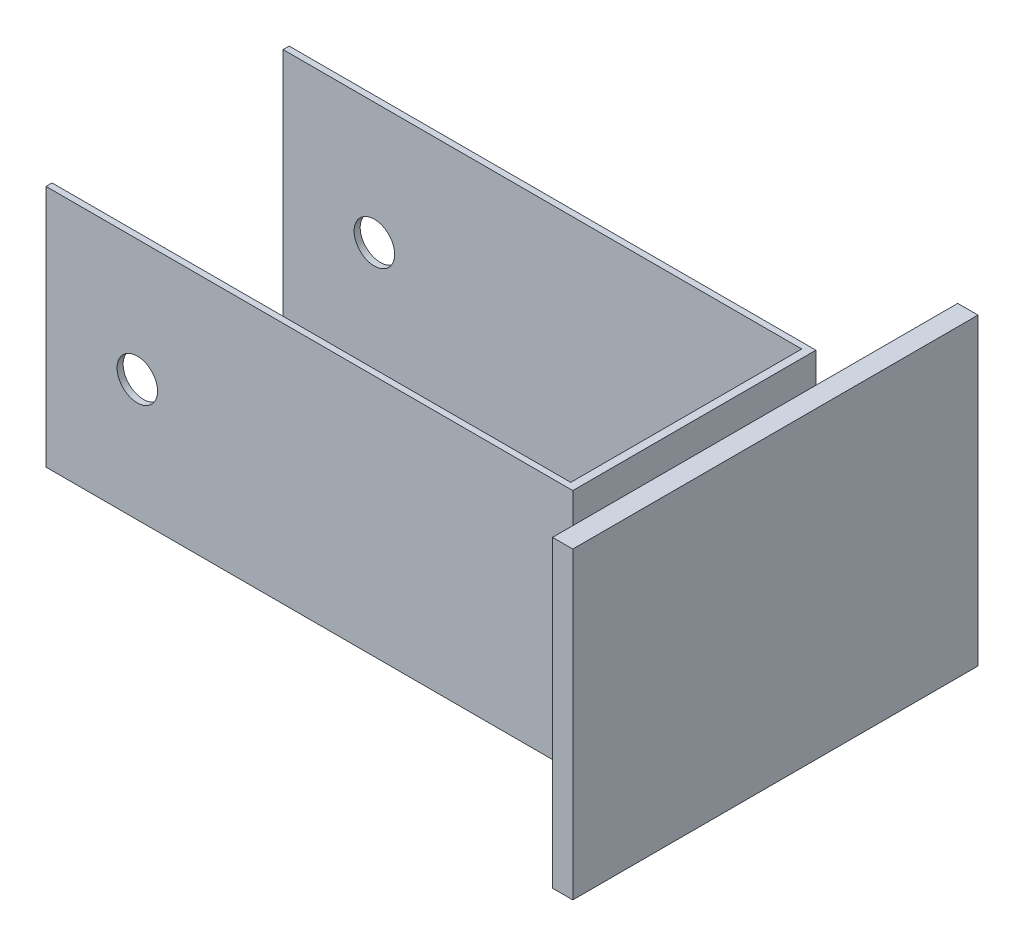
ISO-10303-21;
HEADER;
FILE_DESCRIPTION(('STEP AP214'),'2;1');
FILE_NAME('part.step','',(''),(''),'','','');
FILE_SCHEMA(('AUTOMOTIVE_DESIGN { 1 0 10303 214 1 1 1 1 }'));
ENDSEC;
DATA;
#1=APPLICATION_CONTEXT('core data for automotive mechanical design processes');
#2=APPLICATION_PROTOCOL_DEFINITION('international standard','automotive_design',2000,#1);
#3=PRODUCT_CONTEXT('',#1,'mechanical');
#4=PRODUCT('Part','Part','',(#3));
#5=PRODUCT_RELATED_PRODUCT_CATEGORY('part','',(#4));
#6=PRODUCT_DEFINITION_FORMATION('','',#4);
#7=PRODUCT_DEFINITION_CONTEXT('part definition',#1,'design');
#8=PRODUCT_DEFINITION('design','',#6,#7);
#9=PRODUCT_DEFINITION_SHAPE('','',#8);
#10=(LENGTH_UNIT() NAMED_UNIT(*) SI_UNIT(.MILLI.,.METRE.));
#11=(NAMED_UNIT(*) PLANE_ANGLE_UNIT() SI_UNIT($,.RADIAN.));
#12=(NAMED_UNIT(*) SI_UNIT($,.STERADIAN.) SOLID_ANGLE_UNIT());
#13=UNCERTAINTY_MEASURE_WITH_UNIT(LENGTH_MEASURE(1.E-05),#10,'distance_accuracy_value','');
#14=(GEOMETRIC_REPRESENTATION_CONTEXT(3) GLOBAL_UNCERTAINTY_ASSIGNED_CONTEXT((#13)) GLOBAL_UNIT_ASSIGNED_CONTEXT((#10,
#11,#12)) REPRESENTATION_CONTEXT('',''));
#15=CARTESIAN_POINT('',(0.,0.,0.));
#16=DIRECTION('',(0.,0.,1.));
#17=DIRECTION('',(1.,0.,0.));
#18=AXIS2_PLACEMENT_3D('',#15,#16,#17);
#19=CARTESIAN_POINT('',(65.,57.5848954122928,60.));
#20=DIRECTION('',(0.,0.,1.));
#21=DIRECTION('',(1.,0.,0.));
#22=AXIS2_PLACEMENT_3D('',#19,#20,#21);
#23=PLANE('',#22);
#24=CARTESIAN_POINT('',(-42.4670371060077,0.,60.));
#25=DIRECTION('',(0.,0.,1.));
#26=DIRECTION('',(1.,0.,0.));
#27=AXIS2_PLACEMENT_3D('',#24,#25,#26);
#28=CIRCLE('',#27,5.);
#29=CARTESIAN_POINT('',(-37.4670371060077,0.,60.));
#30=VERTEX_POINT('',#29);
#31=EDGE_CURVE('E341',#30,#30,#28,.T.);
#32=ORIENTED_EDGE('',*,*,#31,.F.);
#33=EDGE_LOOP('',(#32));
#34=FACE_BOUND('',#33,.T.);
#35=DIRECTION('',(1.,0.,0.));
#36=VECTOR('',#35,1.);
#37=CARTESIAN_POINT('',(65.,-30.,60.));
#38=LINE('',#37,#36);
#39=CARTESIAN_POINT('',(-65.,-30.,60.));
#40=VERTEX_POINT('',#39);
#41=CARTESIAN_POINT('',(65.,-30.,60.));
#42=VERTEX_POINT('',#41);
#43=EDGE_CURVE('E168',#40,#42,#38,.T.);
#44=ORIENTED_EDGE('',*,*,#43,.T.);
#45=DIRECTION('',(0.,-1.,0.));
#46=VECTOR('',#45,1.);
#47=CARTESIAN_POINT('',(65.,25.,60.));
#48=LINE('',#47,#46);
#49=CARTESIAN_POINT('',(65.,30.,60.));
#50=VERTEX_POINT('',#49);
#51=EDGE_CURVE('E107',#50,#42,#48,.T.);
#52=ORIENTED_EDGE('',*,*,#51,.F.);
#53=DIRECTION('',(-1.,0.,0.));
#54=VECTOR('',#53,1.);
#55=CARTESIAN_POINT('',(65.,30.,60.));
#56=LINE('',#55,#54);
#57=CARTESIAN_POINT('',(-65.,30.,60.));
#58=VERTEX_POINT('',#57);
#59=EDGE_CURVE('E64',#50,#58,#56,.T.);
#60=ORIENTED_EDGE('',*,*,#59,.T.);
#61=DIRECTION('',(0.,-1.,0.));
#62=VECTOR('',#61,1.);
#63=CARTESIAN_POINT('',(-65.,30.,60.));
#64=LINE('',#63,#62);
#65=EDGE_CURVE('E101',#58,#40,#64,.T.);
#66=ORIENTED_EDGE('',*,*,#65,.T.);
#67=EDGE_LOOP('',(#44,#52,#60,#66));
#68=FACE_BOUND('',#67,.T.);
#69=ADVANCED_FACE('F38',(#34,#68),#23,.T.);
#70=CARTESIAN_POINT('',(65.,57.5848954122928,0.));
#71=DIRECTION('',(0.,0.,1.));
#72=DIRECTION('',(1.,0.,0.));
#73=AXIS2_PLACEMENT_3D('',#70,#71,#72);
#74=PLANE('',#73);
#75=CARTESIAN_POINT('',(-42.4670371060077,0.,0.));
#76=DIRECTION('',(0.,0.,1.));
#77=DIRECTION('',(1.,0.,0.));
#78=AXIS2_PLACEMENT_3D('',#75,#76,#77);
#79=CIRCLE('',#78,5.);
#80=CARTESIAN_POINT('',(-37.4670371060077,0.,0.));
#81=VERTEX_POINT('',#80);
#82=EDGE_CURVE('E179',#81,#81,#79,.F.);
#83=ORIENTED_EDGE('',*,*,#82,.F.);
#84=EDGE_LOOP('',(#83));
#85=FACE_BOUND('',#84,.T.);
#86=DIRECTION('',(0.,1.,0.));
#87=VECTOR('',#86,1.);
#88=CARTESIAN_POINT('',(65.,57.5848954122928,0.));
#89=LINE('',#88,#87);
#90=CARTESIAN_POINT('',(65.,30.,0.));
#91=VERTEX_POINT('',#90);
#92=CARTESIAN_POINT('',(65.,-30.,0.));
#93=VERTEX_POINT('',#92);
#94=EDGE_CURVE('E47',#91,#93,#89,.F.);
#95=ORIENTED_EDGE('',*,*,#94,.T.);
#96=DIRECTION('',(1.,0.,0.));
#97=VECTOR('',#96,1.);
#98=CARTESIAN_POINT('',(65.,-30.,0.));
#99=LINE('',#98,#97);
#100=CARTESIAN_POINT('',(-65.,-30.,0.));
#101=VERTEX_POINT('',#100);
#102=EDGE_CURVE('E102',#101,#93,#99,.T.);
#103=ORIENTED_EDGE('',*,*,#102,.F.);
#104=DIRECTION('',(0.,-1.,0.));
#105=VECTOR('',#104,1.);
#106=CARTESIAN_POINT('',(-65.,30.,0.));
#107=LINE('',#106,#105);
#108=CARTESIAN_POINT('',(-65.,30.,0.));
#109=VERTEX_POINT('',#108);
#110=EDGE_CURVE('E84',#109,#101,#107,.T.);
#111=ORIENTED_EDGE('',*,*,#110,.F.);
#112=DIRECTION('',(-1.,0.,0.));
#113=VECTOR('',#112,1.);
#114=CARTESIAN_POINT('',(65.,30.,0.));
#115=LINE('',#114,#113);
#116=EDGE_CURVE('E94',#91,#109,#115,.T.);
#117=ORIENTED_EDGE('',*,*,#116,.F.);
#118=EDGE_LOOP('',(#95,#103,#111,#117));
#119=FACE_BOUND('',#118,.T.);
#120=ADVANCED_FACE('F105',(#85,#119),#74,.F.);
#121=CARTESIAN_POINT('',(-65.,30.,60.));
#122=DIRECTION('',(1.,0.,0.));
#123=DIRECTION('',(0.,1.,0.));
#124=AXIS2_PLACEMENT_3D('',#121,#122,#123);
#125=PLANE('',#124);
#126=DIRECTION('',(0.,0.,-1.));
#127=VECTOR('',#126,1.);
#128=CARTESIAN_POINT('',(-65.,-30.,60.));
#129=LINE('',#128,#127);
#130=CARTESIAN_POINT('',(-65.,-30.,1.50000000000002));
#131=VERTEX_POINT('',#130);
#132=EDGE_CURVE('E121',#131,#101,#129,.T.);
#133=ORIENTED_EDGE('',*,*,#132,.F.);
#134=DIRECTION('',(0.,1.,0.));
#135=VECTOR('',#134,1.);
#136=CARTESIAN_POINT('',(-65.,30.,1.50000000000002));
#137=LINE('',#136,#135);
#138=CARTESIAN_POINT('',(-65.,30.,1.50000000000002));
#139=VERTEX_POINT('',#138);
#140=EDGE_CURVE('E87',#131,#139,#137,.T.);
#141=ORIENTED_EDGE('',*,*,#140,.T.);
#142=DIRECTION('',(0.,0.,-1.));
#143=VECTOR('',#142,1.);
#144=CARTESIAN_POINT('',(-65.,30.,60.));
#145=LINE('',#144,#143);
#146=EDGE_CURVE('E79',#139,#109,#145,.T.);
#147=ORIENTED_EDGE('',*,*,#146,.T.);
#148=ORIENTED_EDGE('',*,*,#110,.T.);
#149=EDGE_LOOP('',(#133,#141,#147,#148));
#150=FACE_BOUND('',#149,.T.);
#151=ADVANCED_FACE('F82',(#150),#125,.F.);
#152=CARTESIAN_POINT('',(-65.,30.,58.5));
#153=VERTEX_POINT('',#152);
#154=EDGE_CURVE('E90',#58,#153,#145,.T.);
#155=ORIENTED_EDGE('',*,*,#154,.T.);
#156=DIRECTION('',(0.,-1.,0.));
#157=VECTOR('',#156,1.);
#158=CARTESIAN_POINT('',(-65.,30.,58.5));
#159=LINE('',#158,#157);
#160=CARTESIAN_POINT('',(-65.,-30.,58.5));
#161=VERTEX_POINT('',#160);
#162=EDGE_CURVE('E176',#153,#161,#159,.T.);
#163=ORIENTED_EDGE('',*,*,#162,.T.);
#164=EDGE_CURVE('E122',#40,#161,#129,.T.);
#165=ORIENTED_EDGE('',*,*,#164,.F.);
#166=ORIENTED_EDGE('',*,*,#65,.F.);
#167=EDGE_LOOP('',(#155,#163,#165,#166));
#168=FACE_BOUND('',#167,.T.);
#169=ADVANCED_FACE('F40',(#168),#125,.F.);
#170=CARTESIAN_POINT('',(65.,-30.,60.));
#171=DIRECTION('',(0.,1.,0.));
#172=DIRECTION('',(-1.,0.,0.));
#173=AXIS2_PLACEMENT_3D('',#170,#171,#172);
#174=PLANE('',#173);
#175=DIRECTION('',(-1.,0.,0.));
#176=VECTOR('',#175,1.);
#177=CARTESIAN_POINT('',(63.,-30.,1.5));
#178=LINE('',#177,#176);
#179=CARTESIAN_POINT('',(63.,-30.,1.5));
#180=VERTEX_POINT('',#179);
#181=EDGE_CURVE('E138',#180,#131,#178,.T.);
#182=ORIENTED_EDGE('',*,*,#181,.T.);
#183=ORIENTED_EDGE('',*,*,#132,.T.);
#184=ORIENTED_EDGE('',*,*,#102,.T.);
#185=DIRECTION('',(0.,0.,-1.));
#186=VECTOR('',#185,1.);
#187=CARTESIAN_POINT('',(65.,-30.,60.));
#188=LINE('',#187,#186);
#189=EDGE_CURVE('E118',#42,#93,#188,.T.);
#190=ORIENTED_EDGE('',*,*,#189,.F.);
#191=ORIENTED_EDGE('',*,*,#43,.F.);
#192=ORIENTED_EDGE('',*,*,#164,.T.);
#193=DIRECTION('',(1.,0.,0.));
#194=VECTOR('',#193,1.);
#195=CARTESIAN_POINT('',(63.,-30.,58.5));
#196=LINE('',#195,#194);
#197=CARTESIAN_POINT('',(63.,-30.,58.5));
#198=VERTEX_POINT('',#197);
#199=EDGE_CURVE('E161',#161,#198,#196,.T.);
#200=ORIENTED_EDGE('',*,*,#199,.T.);
#201=DIRECTION('',(0.,0.,-1.));
#202=VECTOR('',#201,1.);
#203=CARTESIAN_POINT('',(63.,-30.,1.5));
#204=LINE('',#203,#202);
#205=EDGE_CURVE('E55',#198,#180,#204,.T.);
#206=ORIENTED_EDGE('',*,*,#205,.T.);
#207=EDGE_LOOP('',(#182,#183,#184,#190,#191,#192,#200,#206));
#208=FACE_BOUND('',#207,.T.);
#209=ADVANCED_FACE('F135',(#208),#174,.F.);
#210=CARTESIAN_POINT('',(65.,30.,60.));
#211=DIRECTION('',(0.,-1.,0.));
#212=DIRECTION('',(1.,0.,0.));
#213=AXIS2_PLACEMENT_3D('',#210,#211,#212);
#214=PLANE('',#213);
#215=ORIENTED_EDGE('',*,*,#146,.F.);
#216=DIRECTION('',(-1.,0.,0.));
#217=VECTOR('',#216,1.);
#218=CARTESIAN_POINT('',(63.,30.,1.5));
#219=LINE('',#218,#217);
#220=CARTESIAN_POINT('',(63.,30.,1.5));
#221=VERTEX_POINT('',#220);
#222=EDGE_CURVE('E163',#221,#139,#219,.T.);
#223=ORIENTED_EDGE('',*,*,#222,.F.);
#224=DIRECTION('',(0.,0.,-1.));
#225=VECTOR('',#224,1.);
#226=CARTESIAN_POINT('',(63.,30.,1.5));
#227=LINE('',#226,#225);
#228=CARTESIAN_POINT('',(63.,30.,58.5));
#229=VERTEX_POINT('',#228);
#230=EDGE_CURVE('E153',#229,#221,#227,.T.);
#231=ORIENTED_EDGE('',*,*,#230,.F.);
#232=DIRECTION('',(1.,0.,0.));
#233=VECTOR('',#232,1.);
#234=CARTESIAN_POINT('',(63.,30.,58.5));
#235=LINE('',#234,#233);
#236=EDGE_CURVE('E181',#153,#229,#235,.T.);
#237=ORIENTED_EDGE('',*,*,#236,.F.);
#238=ORIENTED_EDGE('',*,*,#154,.F.);
#239=ORIENTED_EDGE('',*,*,#59,.F.);
#240=DIRECTION('',(0.,0.,-1.));
#241=VECTOR('',#240,1.);
#242=CARTESIAN_POINT('',(65.,30.,60.));
#243=LINE('',#242,#241);
#244=EDGE_CURVE('E98',#50,#91,#243,.T.);
#245=ORIENTED_EDGE('',*,*,#244,.T.);
#246=ORIENTED_EDGE('',*,*,#116,.T.);
#247=EDGE_LOOP('',(#215,#223,#231,#237,#238,#239,#245,#246));
#248=FACE_BOUND('',#247,.T.);
#249=ADVANCED_FACE('F95',(#248),#214,.F.);
#250=CARTESIAN_POINT('',(65.,25.,-1.2E-05));
#251=DIRECTION('',(-1.,0.,0.));
#252=DIRECTION('',(0.,0.,1.));
#253=AXIS2_PLACEMENT_3D('',#250,#251,#252);
#254=PLANE('',#253);
#255=CARTESIAN_POINT('',(65.,0.,30.));
#256=DIRECTION('',(1.,0.,0.));
#257=DIRECTION('',(0.,0.,-1.));
#258=AXIS2_PLACEMENT_3D('',#255,#256,#257);
#259=CIRCLE('',#258,15.);
#260=CARTESIAN_POINT('',(65.,0.,15.));
#261=VERTEX_POINT('',#260);
#262=EDGE_CURVE('E11',#261,#261,#259,.T.);
#263=ORIENTED_EDGE('',*,*,#262,.F.);
#264=EDGE_LOOP('',(#263));
#265=FACE_BOUND('',#264,.T.);
#266=ORIENTED_EDGE('',*,*,#94,.F.);
#267=ORIENTED_EDGE('',*,*,#244,.F.);
#268=ORIENTED_EDGE('',*,*,#51,.T.);
#269=ORIENTED_EDGE('',*,*,#189,.T.);
#270=EDGE_LOOP('',(#266,#267,#268,#269));
#271=FACE_BOUND('',#270,.T.);
#272=ADVANCED_FACE('F131',(#265,#271),#254,.F.);
#273=CARTESIAN_POINT('',(63.,-30.,1.5));
#274=DIRECTION('',(0.,0.,-1.));
#275=DIRECTION('',(-1.,0.,0.));
#276=AXIS2_PLACEMENT_3D('',#273,#274,#275);
#277=PLANE('',#276);
#278=CARTESIAN_POINT('',(-42.4670371060077,0.,1.50000000000002));
#279=DIRECTION('',(0.,0.,-1.));
#280=DIRECTION('',(-1.,0.,0.));
#281=AXIS2_PLACEMENT_3D('',#278,#279,#280);
#282=CIRCLE('',#281,5.);
#283=CARTESIAN_POINT('',(-47.4670371060077,0.,1.50000000000002));
#284=VERTEX_POINT('',#283);
#285=EDGE_CURVE('E184',#284,#284,#282,.F.);
#286=ORIENTED_EDGE('',*,*,#285,.F.);
#287=EDGE_LOOP('',(#286));
#288=FACE_BOUND('',#287,.T.);
#289=ORIENTED_EDGE('',*,*,#222,.T.);
#290=ORIENTED_EDGE('',*,*,#140,.F.);
#291=ORIENTED_EDGE('',*,*,#181,.F.);
#292=DIRECTION('',(0.,1.,0.));
#293=VECTOR('',#292,1.);
#294=CARTESIAN_POINT('',(63.,-30.,1.5));
#295=LINE('',#294,#293);
#296=EDGE_CURVE('E111',#180,#221,#295,.T.);
#297=ORIENTED_EDGE('',*,*,#296,.T.);
#298=EDGE_LOOP('',(#289,#290,#291,#297));
#299=FACE_BOUND('',#298,.T.);
#300=ADVANCED_FACE('F158',(#288,#299),#277,.F.);
#301=CARTESIAN_POINT('',(63.,-30.,1.5));
#302=DIRECTION('',(1.,0.,0.));
#303=DIRECTION('',(0.,0.,-1.));
#304=AXIS2_PLACEMENT_3D('',#301,#302,#303);
#305=PLANE('',#304);
#306=ORIENTED_EDGE('',*,*,#296,.F.);
#307=ORIENTED_EDGE('',*,*,#205,.F.);
#308=DIRECTION('',(0.,1.,0.));
#309=VECTOR('',#308,1.);
#310=CARTESIAN_POINT('',(63.,-30.,58.5));
#311=LINE('',#310,#309);
#312=EDGE_CURVE('E156',#198,#229,#311,.T.);
#313=ORIENTED_EDGE('',*,*,#312,.T.);
#314=ORIENTED_EDGE('',*,*,#230,.T.);
#315=EDGE_LOOP('',(#306,#307,#313,#314));
#316=FACE_BOUND('',#315,.T.);
#317=ADVANCED_FACE('F151',(#316),#305,.F.);
#318=CARTESIAN_POINT('',(63.,-30.,58.5));
#319=DIRECTION('',(0.,0.,1.));
#320=DIRECTION('',(1.,0.,0.));
#321=AXIS2_PLACEMENT_3D('',#318,#319,#320);
#322=PLANE('',#321);
#323=CARTESIAN_POINT('',(-42.4670371060077,0.,58.5));
#324=DIRECTION('',(0.,0.,1.));
#325=DIRECTION('',(1.,0.,0.));
#326=AXIS2_PLACEMENT_3D('',#323,#324,#325);
#327=CIRCLE('',#326,5.);
#328=CARTESIAN_POINT('',(-37.4670371060077,0.,58.5));
#329=VERTEX_POINT('',#328);
#330=EDGE_CURVE('E42',#329,#329,#327,.F.);
#331=ORIENTED_EDGE('',*,*,#330,.F.);
#332=EDGE_LOOP('',(#331));
#333=FACE_BOUND('',#332,.T.);
#334=ORIENTED_EDGE('',*,*,#312,.F.);
#335=ORIENTED_EDGE('',*,*,#199,.F.);
#336=ORIENTED_EDGE('',*,*,#162,.F.);
#337=ORIENTED_EDGE('',*,*,#236,.T.);
#338=EDGE_LOOP('',(#334,#335,#336,#337));
#339=FACE_BOUND('',#338,.T.);
#340=ADVANCED_FACE('F191',(#333,#339),#322,.F.);
#341=CARTESIAN_POINT('',(-42.4670371060077,0.,60.));
#342=DIRECTION('',(0.,0.,-1.));
#343=DIRECTION('',(-1.,0.,0.));
#344=AXIS2_PLACEMENT_3D('',#341,#342,#343);
#345=CYLINDRICAL_SURFACE('',#344,5.);
#346=ORIENTED_EDGE('',*,*,#31,.T.);
#347=EDGE_LOOP('',(#346));
#348=FACE_BOUND('',#347,.T.);
#349=ORIENTED_EDGE('',*,*,#330,.T.);
#350=EDGE_LOOP('',(#349));
#351=FACE_BOUND('',#350,.T.);
#352=ADVANCED_FACE('F193',(#348,#351),#345,.F.);
#353=ORIENTED_EDGE('',*,*,#285,.T.);
#354=EDGE_LOOP('',(#353));
#355=FACE_BOUND('',#354,.T.);
#356=ORIENTED_EDGE('',*,*,#82,.T.);
#357=EDGE_LOOP('',(#356));
#358=FACE_BOUND('',#357,.T.);
#359=ADVANCED_FACE('F200',(#355,#358),#345,.F.);
#360=CARTESIAN_POINT('',(80.,0.,30.));
#361=DIRECTION('',(-1.,0.,0.));
#362=DIRECTION('',(0.,0.,1.));
#363=AXIS2_PLACEMENT_3D('',#360,#361,#362);
#364=CYLINDRICAL_SURFACE('',#363,15.);
#365=CARTESIAN_POINT('',(80.,0.,30.));
#366=DIRECTION('',(1.,0.,0.));
#367=DIRECTION('',(0.,0.,-1.));
#368=AXIS2_PLACEMENT_3D('',#365,#366,#367);
#369=CIRCLE('',#368,15.);
#370=CARTESIAN_POINT('',(80.,0.,15.));
#371=VERTEX_POINT('',#370);
#372=EDGE_CURVE('E344',#371,#371,#369,.T.);
#373=ORIENTED_EDGE('',*,*,#372,.F.);
#374=EDGE_LOOP('',(#373));
#375=FACE_BOUND('',#374,.T.);
#376=ORIENTED_EDGE('',*,*,#262,.T.);
#377=EDGE_LOOP('',(#376));
#378=FACE_BOUND('',#377,.T.);
#379=ADVANCED_FACE('F262',(#375,#378),#364,.T.);
#380=CARTESIAN_POINT('',(85.,37.5,80.));
#381=DIRECTION('',(0.,0.,-1.));
#382=DIRECTION('',(0.,1.,0.));
#383=AXIS2_PLACEMENT_3D('',#380,#381,#382);
#384=PLANE('',#383);
#385=DIRECTION('',(0.,-1.,0.));
#386=VECTOR('',#385,1.);
#387=CARTESIAN_POINT('',(80.,37.5,80.));
#388=LINE('',#387,#386);
#389=CARTESIAN_POINT('',(80.,37.5,80.));
#390=VERTEX_POINT('',#389);
#391=CARTESIAN_POINT('',(80.,-37.5,80.));
#392=VERTEX_POINT('',#391);
#393=EDGE_CURVE('E370',#390,#392,#388,.T.);
#394=ORIENTED_EDGE('',*,*,#393,.T.);
#395=DIRECTION('',(-1.,0.,0.));
#396=VECTOR('',#395,1.);
#397=CARTESIAN_POINT('',(85.,-37.5,80.));
#398=LINE('',#397,#396);
#399=CARTESIAN_POINT('',(85.,-37.5,80.));
#400=VERTEX_POINT('',#399);
#401=EDGE_CURVE('E347',#400,#392,#398,.T.);
#402=ORIENTED_EDGE('',*,*,#401,.F.);
#403=DIRECTION('',(0.,-1.,0.));
#404=VECTOR('',#403,1.);
#405=CARTESIAN_POINT('',(85.,37.5,80.));
#406=LINE('',#405,#404);
#407=CARTESIAN_POINT('',(85.,37.5,80.));
#408=VERTEX_POINT('',#407);
#409=EDGE_CURVE('E363',#408,#400,#406,.T.);
#410=ORIENTED_EDGE('',*,*,#409,.F.);
#411=DIRECTION('',(-1.,0.,0.));
#412=VECTOR('',#411,1.);
#413=CARTESIAN_POINT('',(85.,37.5,80.));
#414=LINE('',#413,#412);
#415=EDGE_CURVE('E356',#408,#390,#414,.T.);
#416=ORIENTED_EDGE('',*,*,#415,.T.);
#417=EDGE_LOOP('',(#394,#402,#410,#416));
#418=FACE_BOUND('',#417,.T.);
#419=ADVANCED_FACE('F266',(#418),#384,.F.);
#420=CARTESIAN_POINT('',(85.,-37.5,-20.));
#421=DIRECTION('',(0.,1.,0.));
#422=DIRECTION('',(0.,0.,1.));
#423=AXIS2_PLACEMENT_3D('',#420,#421,#422);
#424=PLANE('',#423);
#425=DIRECTION('',(0.,0.,-1.));
#426=VECTOR('',#425,1.);
#427=CARTESIAN_POINT('',(80.,-37.5,-20.));
#428=LINE('',#427,#426);
#429=CARTESIAN_POINT('',(80.,-37.5,-20.));
#430=VERTEX_POINT('',#429);
#431=EDGE_CURVE('E367',#392,#430,#428,.T.);
#432=ORIENTED_EDGE('',*,*,#431,.T.);
#433=DIRECTION('',(-1.,0.,0.));
#434=VECTOR('',#433,1.);
#435=CARTESIAN_POINT('',(85.,-37.5,-20.));
#436=LINE('',#435,#434);
#437=CARTESIAN_POINT('',(85.,-37.5,-20.));
#438=VERTEX_POINT('',#437);
#439=EDGE_CURVE('E350',#438,#430,#436,.T.);
#440=ORIENTED_EDGE('',*,*,#439,.F.);
#441=DIRECTION('',(0.,0.,-1.));
#442=VECTOR('',#441,1.);
#443=CARTESIAN_POINT('',(85.,-37.5,-20.));
#444=LINE('',#443,#442);
#445=EDGE_CURVE('E378',#400,#438,#444,.T.);
#446=ORIENTED_EDGE('',*,*,#445,.F.);
#447=ORIENTED_EDGE('',*,*,#401,.T.);
#448=EDGE_LOOP('',(#432,#440,#446,#447));
#449=FACE_BOUND('',#448,.T.);
#450=ADVANCED_FACE('F277',(#449),#424,.F.);
#451=CARTESIAN_POINT('',(85.,37.5,-20.));
#452=DIRECTION('',(0.,0.,1.));
#453=DIRECTION('',(0.,-1.,0.));
#454=AXIS2_PLACEMENT_3D('',#451,#452,#453);
#455=PLANE('',#454);
#456=DIRECTION('',(0.,1.,0.));
#457=VECTOR('',#456,1.);
#458=CARTESIAN_POINT('',(80.,37.5,-20.));
#459=LINE('',#458,#457);
#460=CARTESIAN_POINT('',(80.,37.5,-20.));
#461=VERTEX_POINT('',#460);
#462=EDGE_CURVE('E364',#430,#461,#459,.T.);
#463=ORIENTED_EDGE('',*,*,#462,.T.);
#464=DIRECTION('',(-1.,0.,0.));
#465=VECTOR('',#464,1.);
#466=CARTESIAN_POINT('',(85.,37.5,-20.));
#467=LINE('',#466,#465);
#468=CARTESIAN_POINT('',(85.,37.5,-20.));
#469=VERTEX_POINT('',#468);
#470=EDGE_CURVE('E353',#469,#461,#467,.T.);
#471=ORIENTED_EDGE('',*,*,#470,.F.);
#472=DIRECTION('',(0.,1.,0.));
#473=VECTOR('',#472,1.);
#474=CARTESIAN_POINT('',(85.,37.5,-20.));
#475=LINE('',#474,#473);
#476=EDGE_CURVE('E375',#438,#469,#475,.T.);
#477=ORIENTED_EDGE('',*,*,#476,.F.);
#478=ORIENTED_EDGE('',*,*,#439,.T.);
#479=EDGE_LOOP('',(#463,#471,#477,#478));
#480=FACE_BOUND('',#479,.T.);
#481=ADVANCED_FACE('F287',(#480),#455,.F.);
#482=CARTESIAN_POINT('',(85.,37.5,-20.));
#483=DIRECTION('',(0.,-1.,0.));
#484=DIRECTION('',(0.,0.,-1.));
#485=AXIS2_PLACEMENT_3D('',#482,#483,#484);
#486=PLANE('',#485);
#487=DIRECTION('',(0.,0.,1.));
#488=VECTOR('',#487,1.);
#489=CARTESIAN_POINT('',(80.,37.5,-20.));
#490=LINE('',#489,#488);
#491=EDGE_CURVE('E360',#461,#390,#490,.T.);
#492=ORIENTED_EDGE('',*,*,#491,.T.);
#493=ORIENTED_EDGE('',*,*,#415,.F.);
#494=DIRECTION('',(0.,0.,1.));
#495=VECTOR('',#494,1.);
#496=CARTESIAN_POINT('',(85.,37.5,-20.));
#497=LINE('',#496,#495);
#498=EDGE_CURVE('E359',#469,#408,#497,.T.);
#499=ORIENTED_EDGE('',*,*,#498,.F.);
#500=ORIENTED_EDGE('',*,*,#470,.T.);
#501=EDGE_LOOP('',(#492,#493,#499,#500));
#502=FACE_BOUND('',#501,.T.);
#503=ADVANCED_FACE('F297',(#502),#486,.F.);
#504=CARTESIAN_POINT('',(85.,0.,0.));
#505=DIRECTION('',(-1.,0.,0.));
#506=DIRECTION('',(0.,0.,1.));
#507=AXIS2_PLACEMENT_3D('',#504,#505,#506);
#508=PLANE('',#507);
#509=ORIENTED_EDGE('',*,*,#409,.T.);
#510=ORIENTED_EDGE('',*,*,#445,.T.);
#511=ORIENTED_EDGE('',*,*,#476,.T.);
#512=ORIENTED_EDGE('',*,*,#498,.T.);
#513=EDGE_LOOP('',(#509,#510,#511,#512));
#514=FACE_BOUND('',#513,.T.);
#515=ADVANCED_FACE('F307',(#514),#508,.F.);
#516=CARTESIAN_POINT('',(80.,0.,0.));
#517=DIRECTION('',(-1.,0.,0.));
#518=DIRECTION('',(0.,0.,1.));
#519=AXIS2_PLACEMENT_3D('',#516,#517,#518);
#520=PLANE('',#519);
#521=ORIENTED_EDGE('',*,*,#372,.T.);
#522=EDGE_LOOP('',(#521));
#523=FACE_BOUND('',#522,.T.);
#524=ORIENTED_EDGE('',*,*,#393,.F.);
#525=ORIENTED_EDGE('',*,*,#491,.F.);
#526=ORIENTED_EDGE('',*,*,#462,.F.);
#527=ORIENTED_EDGE('',*,*,#431,.F.);
#528=EDGE_LOOP('',(#524,#525,#526,#527));
#529=FACE_BOUND('',#528,.T.);
#530=ADVANCED_FACE('F317',(#523,#529),#520,.T.);
#531=CLOSED_SHELL('',(#69,#120,#151,#169,#209,#249,#272,#300,#317,#340,#352,#359,#379,#419,#450,
#481,#503,#515,#530));
#532=MANIFOLD_SOLID_BREP('B2',#531);
#533=ADVANCED_BREP_SHAPE_REPRESENTATION('',(#18,#532),#14);
#534=SHAPE_DEFINITION_REPRESENTATION(#9,#533);
ENDSEC;
END-ISO-10303-21;
